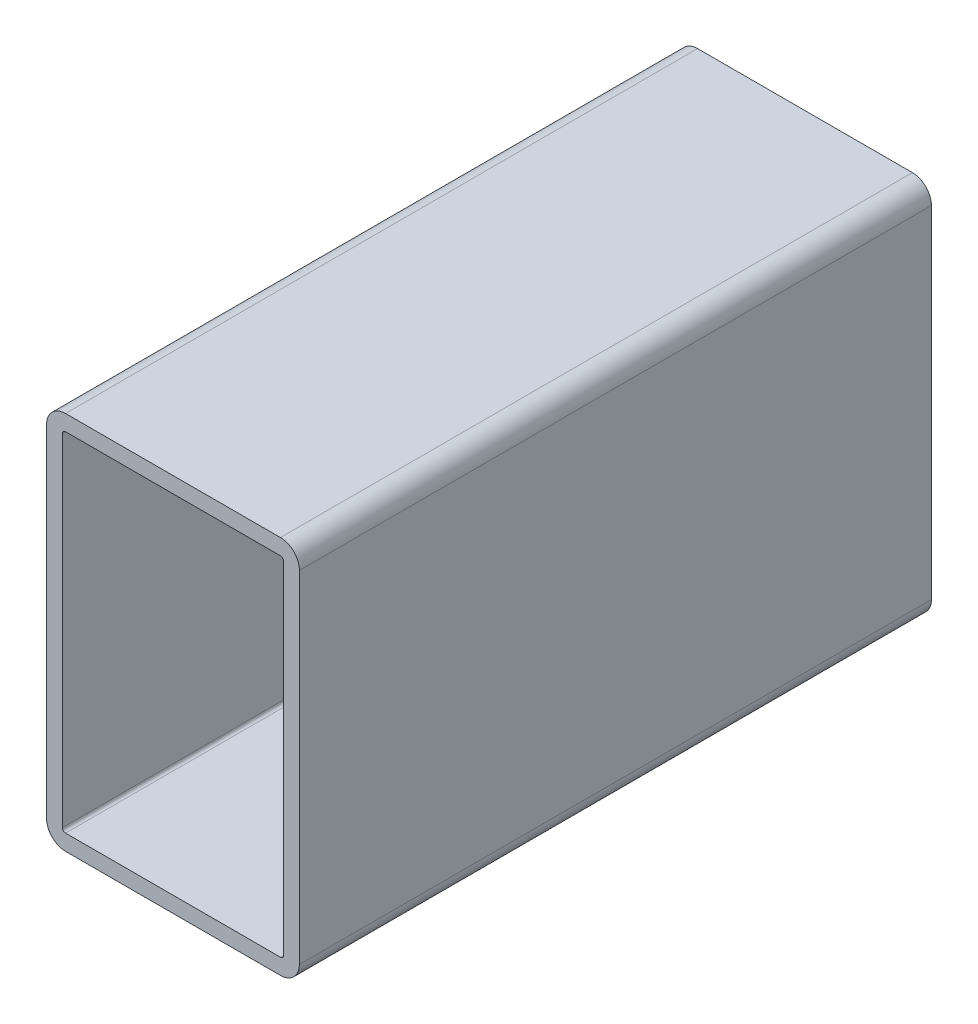
ISO-10303-21;
HEADER;
FILE_DESCRIPTION(('STEP AP214'),'2;1');
FILE_NAME('part.step','',(''),(''),'','','');
FILE_SCHEMA(('AUTOMOTIVE_DESIGN { 1 0 10303 214 1 1 1 1 }'));
ENDSEC;
DATA;
#1=APPLICATION_CONTEXT('core data for automotive mechanical design processes');
#2=APPLICATION_PROTOCOL_DEFINITION('international standard','automotive_design',2000,#1);
#3=PRODUCT_CONTEXT('',#1,'mechanical');
#4=PRODUCT('Part','Part','',(#3));
#5=PRODUCT_RELATED_PRODUCT_CATEGORY('part','',(#4));
#6=PRODUCT_DEFINITION_FORMATION('','',#4);
#7=PRODUCT_DEFINITION_CONTEXT('part definition',#1,'design');
#8=PRODUCT_DEFINITION('design','',#6,#7);
#9=PRODUCT_DEFINITION_SHAPE('','',#8);
#10=(LENGTH_UNIT() NAMED_UNIT(*) SI_UNIT(.MILLI.,.METRE.));
#11=(NAMED_UNIT(*) PLANE_ANGLE_UNIT() SI_UNIT($,.RADIAN.));
#12=(NAMED_UNIT(*) SI_UNIT($,.STERADIAN.) SOLID_ANGLE_UNIT());
#13=UNCERTAINTY_MEASURE_WITH_UNIT(LENGTH_MEASURE(1.E-05),#10,'distance_accuracy_value','');
#14=(GEOMETRIC_REPRESENTATION_CONTEXT(3) GLOBAL_UNCERTAINTY_ASSIGNED_CONTEXT((#13)) GLOBAL_UNIT_ASSIGNED_CONTEXT((#10,
#11,#12)) REPRESENTATION_CONTEXT('',''));
#15=CARTESIAN_POINT('',(0.,0.,0.));
#16=DIRECTION('',(0.,0.,1.));
#17=DIRECTION('',(1.,0.,0.));
#18=AXIS2_PLACEMENT_3D('',#15,#16,#17);
#19=CARTESIAN_POINT('',(37.,3.,100.));
#20=DIRECTION('',(0.,0.,1.));
#21=DIRECTION('',(1.,0.,0.));
#22=AXIS2_PLACEMENT_3D('',#19,#20,#21);
#23=PLANE('',#22);
#24=CARTESIAN_POINT('',(37.,3.,100.));
#25=DIRECTION('',(0.,0.,1.));
#26=DIRECTION('',(1.,0.,0.));
#27=AXIS2_PLACEMENT_3D('',#24,#25,#26);
#28=CIRCLE('',#27,3.);
#29=CARTESIAN_POINT('',(37.,0.,100.));
#30=VERTEX_POINT('',#29);
#31=CARTESIAN_POINT('',(40.,3.00000000000002,100.));
#32=VERTEX_POINT('',#31);
#33=EDGE_CURVE('E215',#30,#32,#28,.T.);
#34=ORIENTED_EDGE('',*,*,#33,.T.);
#35=DIRECTION('',(0.,1.,0.));
#36=VECTOR('',#35,1.);
#37=CARTESIAN_POINT('',(40.,3.00000000000002,100.));
#38=LINE('',#37,#36);
#39=CARTESIAN_POINT('',(40.,57.,100.));
#40=VERTEX_POINT('',#39);
#41=EDGE_CURVE('E218',#32,#40,#38,.T.);
#42=ORIENTED_EDGE('',*,*,#41,.T.);
#43=CARTESIAN_POINT('',(37.,57.,100.));
#44=DIRECTION('',(0.,0.,1.));
#45=DIRECTION('',(-1.,0.,0.));
#46=AXIS2_PLACEMENT_3D('',#43,#44,#45);
#47=CIRCLE('',#46,3.);
#48=CARTESIAN_POINT('',(37.,60.,100.));
#49=VERTEX_POINT('',#48);
#50=EDGE_CURVE('E221',#40,#49,#47,.T.);
#51=ORIENTED_EDGE('',*,*,#50,.T.);
#52=DIRECTION('',(-1.,0.,0.));
#53=VECTOR('',#52,1.);
#54=CARTESIAN_POINT('',(3.00000000000002,60.,100.));
#55=LINE('',#54,#53);
#56=CARTESIAN_POINT('',(3.00000000000002,60.,100.));
#57=VERTEX_POINT('',#56);
#58=EDGE_CURVE('E223',#49,#57,#55,.T.);
#59=ORIENTED_EDGE('',*,*,#58,.T.);
#60=CARTESIAN_POINT('',(3.,57.,100.));
#61=DIRECTION('',(0.,0.,1.));
#62=DIRECTION('',(-1.,0.,0.));
#63=AXIS2_PLACEMENT_3D('',#60,#61,#62);
#64=CIRCLE('',#63,3.);
#65=CARTESIAN_POINT('',(0.,57.,100.));
#66=VERTEX_POINT('',#65);
#67=EDGE_CURVE('E225',#57,#66,#64,.T.);
#68=ORIENTED_EDGE('',*,*,#67,.T.);
#69=DIRECTION('',(0.,-1.,0.));
#70=VECTOR('',#69,1.);
#71=CARTESIAN_POINT('',(0.,3.00000000000002,100.));
#72=LINE('',#71,#70);
#73=CARTESIAN_POINT('',(0.,3.,100.));
#74=VERTEX_POINT('',#73);
#75=EDGE_CURVE('E227',#66,#74,#72,.T.);
#76=ORIENTED_EDGE('',*,*,#75,.T.);
#77=CARTESIAN_POINT('',(3.,3.,100.));
#78=DIRECTION('',(0.,0.,1.));
#79=DIRECTION('',(-1.,0.,0.));
#80=AXIS2_PLACEMENT_3D('',#77,#78,#79);
#81=CIRCLE('',#80,3.);
#82=CARTESIAN_POINT('',(3.00000000000002,0.,100.));
#83=VERTEX_POINT('',#82);
#84=EDGE_CURVE('E229',#74,#83,#81,.T.);
#85=ORIENTED_EDGE('',*,*,#84,.T.);
#86=DIRECTION('',(1.,0.,0.));
#87=VECTOR('',#86,1.);
#88=CARTESIAN_POINT('',(3.00000000000002,0.,100.));
#89=LINE('',#88,#87);
#90=EDGE_CURVE('E231',#83,#30,#89,.T.);
#91=ORIENTED_EDGE('',*,*,#90,.T.);
#92=EDGE_LOOP('',(#34,#42,#51,#59,#68,#76,#85,#91));
#93=FACE_BOUND('',#92,.T.);
#94=DIRECTION('',(1.,0.,0.));
#95=VECTOR('',#94,1.);
#96=CARTESIAN_POINT('',(3.00000000000002,2.5,100.));
#97=LINE('',#96,#95);
#98=CARTESIAN_POINT('',(3.00000000000002,2.5,100.));
#99=VERTEX_POINT('',#98);
#100=CARTESIAN_POINT('',(37.,2.5,100.));
#101=VERTEX_POINT('',#100);
#102=EDGE_CURVE('E158',#99,#101,#97,.T.);
#103=ORIENTED_EDGE('',*,*,#102,.F.);
#104=CARTESIAN_POINT('',(3.,3.,100.));
#105=DIRECTION('',(0.,0.,1.));
#106=DIRECTION('',(-1.,0.,0.));
#107=AXIS2_PLACEMENT_3D('',#104,#105,#106);
#108=CIRCLE('',#107,0.5);
#109=CARTESIAN_POINT('',(2.5,3.00000000000002,100.));
#110=VERTEX_POINT('',#109);
#111=EDGE_CURVE('E150',#110,#99,#108,.T.);
#112=ORIENTED_EDGE('',*,*,#111,.F.);
#113=DIRECTION('',(0.,-1.,0.));
#114=VECTOR('',#113,1.);
#115=CARTESIAN_POINT('',(2.5,3.00000000000002,100.));
#116=LINE('',#115,#114);
#117=CARTESIAN_POINT('',(2.5,57.,100.));
#118=VERTEX_POINT('',#117);
#119=EDGE_CURVE('E183',#118,#110,#116,.T.);
#120=ORIENTED_EDGE('',*,*,#119,.F.);
#121=CARTESIAN_POINT('',(3.,57.,100.));
#122=DIRECTION('',(0.,0.,1.));
#123=DIRECTION('',(-1.,0.,0.));
#124=AXIS2_PLACEMENT_3D('',#121,#122,#123);
#125=CIRCLE('',#124,0.500000000000001);
#126=CARTESIAN_POINT('',(3.00000000000002,57.5,100.));
#127=VERTEX_POINT('',#126);
#128=EDGE_CURVE('E181',#127,#118,#125,.T.);
#129=ORIENTED_EDGE('',*,*,#128,.F.);
#130=DIRECTION('',(-1.,0.,0.));
#131=VECTOR('',#130,1.);
#132=CARTESIAN_POINT('',(3.00000000000002,57.5,100.));
#133=LINE('',#132,#131);
#134=CARTESIAN_POINT('',(37.,57.5,100.));
#135=VERTEX_POINT('',#134);
#136=EDGE_CURVE('E179',#135,#127,#133,.T.);
#137=ORIENTED_EDGE('',*,*,#136,.F.);
#138=CARTESIAN_POINT('',(37.,57.,100.));
#139=DIRECTION('',(0.,0.,1.));
#140=DIRECTION('',(-1.,0.,0.));
#141=AXIS2_PLACEMENT_3D('',#138,#139,#140);
#142=CIRCLE('',#141,0.500000000000007);
#143=CARTESIAN_POINT('',(37.5,57.,100.));
#144=VERTEX_POINT('',#143);
#145=EDGE_CURVE('E177',#144,#135,#142,.T.);
#146=ORIENTED_EDGE('',*,*,#145,.F.);
#147=DIRECTION('',(0.,1.,0.));
#148=VECTOR('',#147,1.);
#149=CARTESIAN_POINT('',(37.5,3.,100.));
#150=LINE('',#149,#148);
#151=CARTESIAN_POINT('',(37.5,3.,100.));
#152=VERTEX_POINT('',#151);
#153=EDGE_CURVE('E173',#152,#144,#150,.T.);
#154=ORIENTED_EDGE('',*,*,#153,.F.);
#155=CARTESIAN_POINT('',(37.,3.,100.));
#156=DIRECTION('',(0.,0.,1.));
#157=DIRECTION('',(1.,0.,0.));
#158=AXIS2_PLACEMENT_3D('',#155,#156,#157);
#159=CIRCLE('',#158,0.5);
#160=EDGE_CURVE('E171',#101,#152,#159,.T.);
#161=ORIENTED_EDGE('',*,*,#160,.F.);
#162=EDGE_LOOP('',(#103,#112,#120,#129,#137,#146,#154,#161));
#163=FACE_BOUND('',#162,.T.);
#164=ADVANCED_FACE('F37',(#93,#163),#23,.T.);
#165=CARTESIAN_POINT('',(37.,3.,0.));
#166=DIRECTION('',(0.,0.,1.));
#167=DIRECTION('',(1.,0.,0.));
#168=AXIS2_PLACEMENT_3D('',#165,#166,#167);
#169=PLANE('',#168);
#170=CARTESIAN_POINT('',(37.,3.,0.));
#171=DIRECTION('',(0.,0.,1.));
#172=DIRECTION('',(1.,0.,0.));
#173=AXIS2_PLACEMENT_3D('',#170,#171,#172);
#174=CIRCLE('',#173,3.);
#175=CARTESIAN_POINT('',(37.,0.,0.));
#176=VERTEX_POINT('',#175);
#177=CARTESIAN_POINT('',(40.,3.00000000000002,0.));
#178=VERTEX_POINT('',#177);
#179=EDGE_CURVE('E166',#176,#178,#174,.T.);
#180=ORIENTED_EDGE('',*,*,#179,.F.);
#181=DIRECTION('',(1.,0.,0.));
#182=VECTOR('',#181,1.);
#183=CARTESIAN_POINT('',(3.00000000000002,0.,0.));
#184=LINE('',#183,#182);
#185=CARTESIAN_POINT('',(3.00000000000002,0.,0.));
#186=VERTEX_POINT('',#185);
#187=EDGE_CURVE('E219',#186,#176,#184,.T.);
#188=ORIENTED_EDGE('',*,*,#187,.F.);
#189=CARTESIAN_POINT('',(3.,3.,0.));
#190=DIRECTION('',(0.,0.,1.));
#191=DIRECTION('',(-1.,0.,0.));
#192=AXIS2_PLACEMENT_3D('',#189,#190,#191);
#193=CIRCLE('',#192,3.);
#194=CARTESIAN_POINT('',(0.,3.,0.));
#195=VERTEX_POINT('',#194);
#196=EDGE_CURVE('E246',#195,#186,#193,.T.);
#197=ORIENTED_EDGE('',*,*,#196,.F.);
#198=DIRECTION('',(0.,-1.,0.));
#199=VECTOR('',#198,1.);
#200=CARTESIAN_POINT('',(0.,3.00000000000002,0.));
#201=LINE('',#200,#199);
#202=CARTESIAN_POINT('',(0.,57.,0.));
#203=VERTEX_POINT('',#202);
#204=EDGE_CURVE('E244',#203,#195,#201,.T.);
#205=ORIENTED_EDGE('',*,*,#204,.F.);
#206=CARTESIAN_POINT('',(3.,57.,0.));
#207=DIRECTION('',(0.,0.,1.));
#208=DIRECTION('',(-1.,0.,0.));
#209=AXIS2_PLACEMENT_3D('',#206,#207,#208);
#210=CIRCLE('',#209,3.);
#211=CARTESIAN_POINT('',(3.00000000000002,60.,0.));
#212=VERTEX_POINT('',#211);
#213=EDGE_CURVE('E242',#212,#203,#210,.T.);
#214=ORIENTED_EDGE('',*,*,#213,.F.);
#215=DIRECTION('',(-1.,0.,0.));
#216=VECTOR('',#215,1.);
#217=CARTESIAN_POINT('',(3.00000000000002,60.,0.));
#218=LINE('',#217,#216);
#219=CARTESIAN_POINT('',(37.,60.,0.));
#220=VERTEX_POINT('',#219);
#221=EDGE_CURVE('E240',#220,#212,#218,.T.);
#222=ORIENTED_EDGE('',*,*,#221,.F.);
#223=CARTESIAN_POINT('',(37.,57.,0.));
#224=DIRECTION('',(0.,0.,1.));
#225=DIRECTION('',(-1.,0.,0.));
#226=AXIS2_PLACEMENT_3D('',#223,#224,#225);
#227=CIRCLE('',#226,3.);
#228=CARTESIAN_POINT('',(40.,57.,0.));
#229=VERTEX_POINT('',#228);
#230=EDGE_CURVE('E238',#229,#220,#227,.T.);
#231=ORIENTED_EDGE('',*,*,#230,.F.);
#232=DIRECTION('',(0.,1.,0.));
#233=VECTOR('',#232,1.);
#234=CARTESIAN_POINT('',(40.,3.00000000000002,0.));
#235=LINE('',#234,#233);
#236=EDGE_CURVE('E236',#178,#229,#235,.T.);
#237=ORIENTED_EDGE('',*,*,#236,.F.);
#238=EDGE_LOOP('',(#180,#188,#197,#205,#214,#222,#231,#237));
#239=FACE_BOUND('',#238,.T.);
#240=CARTESIAN_POINT('',(3.,3.,0.));
#241=DIRECTION('',(0.,0.,1.));
#242=DIRECTION('',(-1.,0.,0.));
#243=AXIS2_PLACEMENT_3D('',#240,#241,#242);
#244=CIRCLE('',#243,0.5);
#245=CARTESIAN_POINT('',(2.5,3.00000000000002,0.));
#246=VERTEX_POINT('',#245);
#247=CARTESIAN_POINT('',(3.00000000000002,2.5,0.));
#248=VERTEX_POINT('',#247);
#249=EDGE_CURVE('E60',#246,#248,#244,.T.);
#250=ORIENTED_EDGE('',*,*,#249,.T.);
#251=DIRECTION('',(1.,0.,0.));
#252=VECTOR('',#251,1.);
#253=CARTESIAN_POINT('',(3.00000000000002,2.5,0.));
#254=LINE('',#253,#252);
#255=CARTESIAN_POINT('',(37.,2.5,0.));
#256=VERTEX_POINT('',#255);
#257=EDGE_CURVE('E165',#248,#256,#254,.T.);
#258=ORIENTED_EDGE('',*,*,#257,.T.);
#259=CARTESIAN_POINT('',(37.,3.,0.));
#260=DIRECTION('',(0.,0.,1.));
#261=DIRECTION('',(1.,0.,0.));
#262=AXIS2_PLACEMENT_3D('',#259,#260,#261);
#263=CIRCLE('',#262,0.5);
#264=CARTESIAN_POINT('',(37.5,3.,0.));
#265=VERTEX_POINT('',#264);
#266=EDGE_CURVE('E187',#256,#265,#263,.T.);
#267=ORIENTED_EDGE('',*,*,#266,.T.);
#268=DIRECTION('',(0.,1.,0.));
#269=VECTOR('',#268,1.);
#270=CARTESIAN_POINT('',(37.5,3.,0.));
#271=LINE('',#270,#269);
#272=CARTESIAN_POINT('',(37.5,57.,0.));
#273=VERTEX_POINT('',#272);
#274=EDGE_CURVE('E190',#265,#273,#271,.T.);
#275=ORIENTED_EDGE('',*,*,#274,.T.);
#276=CARTESIAN_POINT('',(37.,57.,0.));
#277=DIRECTION('',(0.,0.,1.));
#278=DIRECTION('',(-1.,0.,0.));
#279=AXIS2_PLACEMENT_3D('',#276,#277,#278);
#280=CIRCLE('',#279,0.500000000000007);
#281=CARTESIAN_POINT('',(37.,57.5,0.));
#282=VERTEX_POINT('',#281);
#283=EDGE_CURVE('E193',#273,#282,#280,.T.);
#284=ORIENTED_EDGE('',*,*,#283,.T.);
#285=DIRECTION('',(-1.,0.,0.));
#286=VECTOR('',#285,1.);
#287=CARTESIAN_POINT('',(3.00000000000002,57.5,0.));
#288=LINE('',#287,#286);
#289=CARTESIAN_POINT('',(3.00000000000002,57.5,0.));
#290=VERTEX_POINT('',#289);
#291=EDGE_CURVE('E196',#282,#290,#288,.T.);
#292=ORIENTED_EDGE('',*,*,#291,.T.);
#293=CARTESIAN_POINT('',(3.,57.,0.));
#294=DIRECTION('',(0.,0.,1.));
#295=DIRECTION('',(-1.,0.,0.));
#296=AXIS2_PLACEMENT_3D('',#293,#294,#295);
#297=CIRCLE('',#296,0.500000000000001);
#298=CARTESIAN_POINT('',(2.5,57.,0.));
#299=VERTEX_POINT('',#298);
#300=EDGE_CURVE('E199',#290,#299,#297,.T.);
#301=ORIENTED_EDGE('',*,*,#300,.T.);
#302=DIRECTION('',(0.,-1.,0.));
#303=VECTOR('',#302,1.);
#304=CARTESIAN_POINT('',(2.5,3.00000000000002,0.));
#305=LINE('',#304,#303);
#306=EDGE_CURVE('E159',#299,#246,#305,.T.);
#307=ORIENTED_EDGE('',*,*,#306,.T.);
#308=EDGE_LOOP('',(#250,#258,#267,#275,#284,#292,#301,#307));
#309=FACE_BOUND('',#308,.T.);
#310=ADVANCED_FACE('F276',(#239,#309),#169,.F.);
#311=CARTESIAN_POINT('',(37.,3.,100.));
#312=DIRECTION('',(0.,0.,-1.));
#313=DIRECTION('',(-1.,0.,0.));
#314=AXIS2_PLACEMENT_3D('',#311,#312,#313);
#315=CYLINDRICAL_SURFACE('',#314,3.);
#316=ORIENTED_EDGE('',*,*,#179,.T.);
#317=DIRECTION('',(0.,0.,-1.));
#318=VECTOR('',#317,1.);
#319=CARTESIAN_POINT('',(40.,3.00000000000002,100.));
#320=LINE('',#319,#318);
#321=EDGE_CURVE('E11',#32,#178,#320,.T.);
#322=ORIENTED_EDGE('',*,*,#321,.F.);
#323=ORIENTED_EDGE('',*,*,#33,.F.);
#324=DIRECTION('',(0.,0.,-1.));
#325=VECTOR('',#324,1.);
#326=CARTESIAN_POINT('',(37.,0.,100.));
#327=LINE('',#326,#325);
#328=EDGE_CURVE('E233',#30,#176,#327,.T.);
#329=ORIENTED_EDGE('',*,*,#328,.T.);
#330=EDGE_LOOP('',(#316,#322,#323,#329));
#331=FACE_BOUND('',#330,.T.);
#332=ADVANCED_FACE('F39',(#331),#315,.T.);
#333=CARTESIAN_POINT('',(40.,3.00000000000002,100.));
#334=DIRECTION('',(-1.,0.,0.));
#335=DIRECTION('',(0.,-1.,0.));
#336=AXIS2_PLACEMENT_3D('',#333,#334,#335);
#337=PLANE('',#336);
#338=ORIENTED_EDGE('',*,*,#236,.T.);
#339=DIRECTION('',(0.,0.,-1.));
#340=VECTOR('',#339,1.);
#341=CARTESIAN_POINT('',(40.,57.,100.));
#342=LINE('',#341,#340);
#343=EDGE_CURVE('E45',#40,#229,#342,.T.);
#344=ORIENTED_EDGE('',*,*,#343,.F.);
#345=ORIENTED_EDGE('',*,*,#41,.F.);
#346=ORIENTED_EDGE('',*,*,#321,.T.);
#347=EDGE_LOOP('',(#338,#344,#345,#346));
#348=FACE_BOUND('',#347,.T.);
#349=ADVANCED_FACE('F293',(#348),#337,.F.);
#350=CARTESIAN_POINT('',(37.,57.,100.));
#351=DIRECTION('',(0.,0.,-1.));
#352=DIRECTION('',(-1.,0.,0.));
#353=AXIS2_PLACEMENT_3D('',#350,#351,#352);
#354=CYLINDRICAL_SURFACE('',#353,3.);
#355=ORIENTED_EDGE('',*,*,#230,.T.);
#356=DIRECTION('',(0.,0.,-1.));
#357=VECTOR('',#356,1.);
#358=CARTESIAN_POINT('',(37.,60.,100.));
#359=LINE('',#358,#357);
#360=EDGE_CURVE('E263',#49,#220,#359,.T.);
#361=ORIENTED_EDGE('',*,*,#360,.F.);
#362=ORIENTED_EDGE('',*,*,#50,.F.);
#363=ORIENTED_EDGE('',*,*,#343,.T.);
#364=EDGE_LOOP('',(#355,#361,#362,#363));
#365=FACE_BOUND('',#364,.T.);
#366=ADVANCED_FACE('F270',(#365),#354,.T.);
#367=CARTESIAN_POINT('',(3.00000000000002,60.,100.));
#368=DIRECTION('',(0.,-1.,0.));
#369=DIRECTION('',(0.,0.,-1.));
#370=AXIS2_PLACEMENT_3D('',#367,#368,#369);
#371=PLANE('',#370);
#372=ORIENTED_EDGE('',*,*,#221,.T.);
#373=DIRECTION('',(0.,0.,-1.));
#374=VECTOR('',#373,1.);
#375=CARTESIAN_POINT('',(3.00000000000002,60.,100.));
#376=LINE('',#375,#374);
#377=EDGE_CURVE('E260',#57,#212,#376,.T.);
#378=ORIENTED_EDGE('',*,*,#377,.F.);
#379=ORIENTED_EDGE('',*,*,#58,.F.);
#380=ORIENTED_EDGE('',*,*,#360,.T.);
#381=EDGE_LOOP('',(#372,#378,#379,#380));
#382=FACE_BOUND('',#381,.T.);
#383=ADVANCED_FACE('F282',(#382),#371,.F.);
#384=CARTESIAN_POINT('',(3.,57.,100.));
#385=DIRECTION('',(0.,0.,-1.));
#386=DIRECTION('',(-1.,0.,0.));
#387=AXIS2_PLACEMENT_3D('',#384,#385,#386);
#388=CYLINDRICAL_SURFACE('',#387,3.);
#389=ORIENTED_EDGE('',*,*,#213,.T.);
#390=DIRECTION('',(0.,0.,-1.));
#391=VECTOR('',#390,1.);
#392=CARTESIAN_POINT('',(0.,57.,100.));
#393=LINE('',#392,#391);
#394=EDGE_CURVE('E257',#66,#203,#393,.T.);
#395=ORIENTED_EDGE('',*,*,#394,.F.);
#396=ORIENTED_EDGE('',*,*,#67,.F.);
#397=ORIENTED_EDGE('',*,*,#377,.T.);
#398=EDGE_LOOP('',(#389,#395,#396,#397));
#399=FACE_BOUND('',#398,.T.);
#400=ADVANCED_FACE('F286',(#399),#388,.T.);
#401=CARTESIAN_POINT('',(0.,3.00000000000002,100.));
#402=DIRECTION('',(1.,0.,0.));
#403=DIRECTION('',(0.,0.,-1.));
#404=AXIS2_PLACEMENT_3D('',#401,#402,#403);
#405=PLANE('',#404);
#406=ORIENTED_EDGE('',*,*,#204,.T.);
#407=DIRECTION('',(0.,0.,-1.));
#408=VECTOR('',#407,1.);
#409=CARTESIAN_POINT('',(0.,3.,100.));
#410=LINE('',#409,#408);
#411=EDGE_CURVE('E254',#74,#195,#410,.T.);
#412=ORIENTED_EDGE('',*,*,#411,.F.);
#413=ORIENTED_EDGE('',*,*,#75,.F.);
#414=ORIENTED_EDGE('',*,*,#394,.T.);
#415=EDGE_LOOP('',(#406,#412,#413,#414));
#416=FACE_BOUND('',#415,.T.);
#417=ADVANCED_FACE('F306',(#416),#405,.F.);
#418=CARTESIAN_POINT('',(3.,3.,100.));
#419=DIRECTION('',(0.,0.,-1.));
#420=DIRECTION('',(-1.,0.,0.));
#421=AXIS2_PLACEMENT_3D('',#418,#419,#420);
#422=CYLINDRICAL_SURFACE('',#421,3.);
#423=ORIENTED_EDGE('',*,*,#196,.T.);
#424=DIRECTION('',(0.,0.,-1.));
#425=VECTOR('',#424,1.);
#426=CARTESIAN_POINT('',(3.00000000000002,0.,100.));
#427=LINE('',#426,#425);
#428=EDGE_CURVE('E251',#83,#186,#427,.T.);
#429=ORIENTED_EDGE('',*,*,#428,.F.);
#430=ORIENTED_EDGE('',*,*,#84,.F.);
#431=ORIENTED_EDGE('',*,*,#411,.T.);
#432=EDGE_LOOP('',(#423,#429,#430,#431));
#433=FACE_BOUND('',#432,.T.);
#434=ADVANCED_FACE('F304',(#433),#422,.T.);
#435=CARTESIAN_POINT('',(3.00000000000002,0.,100.));
#436=DIRECTION('',(0.,1.,0.));
#437=DIRECTION('',(0.,0.,1.));
#438=AXIS2_PLACEMENT_3D('',#435,#436,#437);
#439=PLANE('',#438);
#440=ORIENTED_EDGE('',*,*,#187,.T.);
#441=ORIENTED_EDGE('',*,*,#328,.F.);
#442=ORIENTED_EDGE('',*,*,#90,.F.);
#443=ORIENTED_EDGE('',*,*,#428,.T.);
#444=EDGE_LOOP('',(#440,#441,#442,#443));
#445=FACE_BOUND('',#444,.T.);
#446=ADVANCED_FACE('F299',(#445),#439,.F.);
#447=CARTESIAN_POINT('',(3.,3.,100.));
#448=DIRECTION('',(0.,0.,-1.));
#449=DIRECTION('',(-1.,0.,0.));
#450=AXIS2_PLACEMENT_3D('',#447,#448,#449);
#451=CYLINDRICAL_SURFACE('',#450,0.5);
#452=ORIENTED_EDGE('',*,*,#249,.F.);
#453=DIRECTION('',(0.,0.,-1.));
#454=VECTOR('',#453,1.);
#455=CARTESIAN_POINT('',(2.5,3.00000000000002,100.));
#456=LINE('',#455,#454);
#457=EDGE_CURVE('E154',#110,#246,#456,.T.);
#458=ORIENTED_EDGE('',*,*,#457,.F.);
#459=ORIENTED_EDGE('',*,*,#111,.T.);
#460=DIRECTION('',(0.,0.,-1.));
#461=VECTOR('',#460,1.);
#462=CARTESIAN_POINT('',(3.00000000000002,2.5,100.));
#463=LINE('',#462,#461);
#464=EDGE_CURVE('E153',#99,#248,#463,.T.);
#465=ORIENTED_EDGE('',*,*,#464,.T.);
#466=EDGE_LOOP('',(#452,#458,#459,#465));
#467=FACE_BOUND('',#466,.T.);
#468=ADVANCED_FACE('F152',(#467),#451,.F.);
#469=CARTESIAN_POINT('',(3.00000000000002,2.5,100.));
#470=DIRECTION('',(0.,1.,0.));
#471=DIRECTION('',(0.,0.,1.));
#472=AXIS2_PLACEMENT_3D('',#469,#470,#471);
#473=PLANE('',#472);
#474=ORIENTED_EDGE('',*,*,#257,.F.);
#475=ORIENTED_EDGE('',*,*,#464,.F.);
#476=ORIENTED_EDGE('',*,*,#102,.T.);
#477=DIRECTION('',(0.,0.,-1.));
#478=VECTOR('',#477,1.);
#479=CARTESIAN_POINT('',(37.,2.5,100.));
#480=LINE('',#479,#478);
#481=EDGE_CURVE('E167',#101,#256,#480,.T.);
#482=ORIENTED_EDGE('',*,*,#481,.T.);
#483=EDGE_LOOP('',(#474,#475,#476,#482));
#484=FACE_BOUND('',#483,.T.);
#485=ADVANCED_FACE('F162',(#484),#473,.T.);
#486=CARTESIAN_POINT('',(37.,3.,100.));
#487=DIRECTION('',(0.,0.,-1.));
#488=DIRECTION('',(-1.,0.,0.));
#489=AXIS2_PLACEMENT_3D('',#486,#487,#488);
#490=CYLINDRICAL_SURFACE('',#489,0.5);
#491=ORIENTED_EDGE('',*,*,#266,.F.);
#492=ORIENTED_EDGE('',*,*,#481,.F.);
#493=ORIENTED_EDGE('',*,*,#160,.T.);
#494=DIRECTION('',(0.,0.,-1.));
#495=VECTOR('',#494,1.);
#496=CARTESIAN_POINT('',(37.5,3.,100.));
#497=LINE('',#496,#495);
#498=EDGE_CURVE('E212',#152,#265,#497,.T.);
#499=ORIENTED_EDGE('',*,*,#498,.T.);
#500=EDGE_LOOP('',(#491,#492,#493,#499));
#501=FACE_BOUND('',#500,.T.);
#502=ADVANCED_FACE('F331',(#501),#490,.F.);
#503=CARTESIAN_POINT('',(37.5,3.,100.));
#504=DIRECTION('',(-1.,0.,0.));
#505=DIRECTION('',(0.,0.,1.));
#506=AXIS2_PLACEMENT_3D('',#503,#504,#505);
#507=PLANE('',#506);
#508=ORIENTED_EDGE('',*,*,#274,.F.);
#509=ORIENTED_EDGE('',*,*,#498,.F.);
#510=ORIENTED_EDGE('',*,*,#153,.T.);
#511=DIRECTION('',(0.,0.,-1.));
#512=VECTOR('',#511,1.);
#513=CARTESIAN_POINT('',(37.5,57.,100.));
#514=LINE('',#513,#512);
#515=EDGE_CURVE('E210',#144,#273,#514,.T.);
#516=ORIENTED_EDGE('',*,*,#515,.T.);
#517=EDGE_LOOP('',(#508,#509,#510,#516));
#518=FACE_BOUND('',#517,.T.);
#519=ADVANCED_FACE('F335',(#518),#507,.T.);
#520=CARTESIAN_POINT('',(37.,57.,100.));
#521=DIRECTION('',(0.,0.,-1.));
#522=DIRECTION('',(-1.,0.,0.));
#523=AXIS2_PLACEMENT_3D('',#520,#521,#522);
#524=CYLINDRICAL_SURFACE('',#523,0.500000000000007);
#525=ORIENTED_EDGE('',*,*,#283,.F.);
#526=ORIENTED_EDGE('',*,*,#515,.F.);
#527=ORIENTED_EDGE('',*,*,#145,.T.);
#528=DIRECTION('',(0.,0.,-1.));
#529=VECTOR('',#528,1.);
#530=CARTESIAN_POINT('',(37.,57.5,100.));
#531=LINE('',#530,#529);
#532=EDGE_CURVE('E208',#135,#282,#531,.T.);
#533=ORIENTED_EDGE('',*,*,#532,.T.);
#534=EDGE_LOOP('',(#525,#526,#527,#533));
#535=FACE_BOUND('',#534,.T.);
#536=ADVANCED_FACE('F341',(#535),#524,.F.);
#537=CARTESIAN_POINT('',(3.00000000000002,57.5,100.));
#538=DIRECTION('',(0.,-1.,0.));
#539=DIRECTION('',(0.,0.,-1.));
#540=AXIS2_PLACEMENT_3D('',#537,#538,#539);
#541=PLANE('',#540);
#542=ORIENTED_EDGE('',*,*,#291,.F.);
#543=ORIENTED_EDGE('',*,*,#532,.F.);
#544=ORIENTED_EDGE('',*,*,#136,.T.);
#545=DIRECTION('',(0.,0.,-1.));
#546=VECTOR('',#545,1.);
#547=CARTESIAN_POINT('',(3.00000000000002,57.5,100.));
#548=LINE('',#547,#546);
#549=EDGE_CURVE('E206',#127,#290,#548,.T.);
#550=ORIENTED_EDGE('',*,*,#549,.T.);
#551=EDGE_LOOP('',(#542,#543,#544,#550));
#552=FACE_BOUND('',#551,.T.);
#553=ADVANCED_FACE('F345',(#552),#541,.T.);
#554=CARTESIAN_POINT('',(3.,57.,100.));
#555=DIRECTION('',(0.,0.,-1.));
#556=DIRECTION('',(-1.,0.,0.));
#557=AXIS2_PLACEMENT_3D('',#554,#555,#556);
#558=CYLINDRICAL_SURFACE('',#557,0.500000000000001);
#559=ORIENTED_EDGE('',*,*,#300,.F.);
#560=ORIENTED_EDGE('',*,*,#549,.F.);
#561=ORIENTED_EDGE('',*,*,#128,.T.);
#562=DIRECTION('',(0.,0.,-1.));
#563=VECTOR('',#562,1.);
#564=CARTESIAN_POINT('',(2.5,57.,100.));
#565=LINE('',#564,#563);
#566=EDGE_CURVE('E52',#118,#299,#565,.T.);
#567=ORIENTED_EDGE('',*,*,#566,.T.);
#568=EDGE_LOOP('',(#559,#560,#561,#567));
#569=FACE_BOUND('',#568,.T.);
#570=ADVANCED_FACE('F349',(#569),#558,.F.);
#571=CARTESIAN_POINT('',(2.5,3.00000000000002,100.));
#572=DIRECTION('',(1.,0.,0.));
#573=DIRECTION('',(0.,1.,0.));
#574=AXIS2_PLACEMENT_3D('',#571,#572,#573);
#575=PLANE('',#574);
#576=ORIENTED_EDGE('',*,*,#306,.F.);
#577=ORIENTED_EDGE('',*,*,#566,.F.);
#578=ORIENTED_EDGE('',*,*,#119,.T.);
#579=ORIENTED_EDGE('',*,*,#457,.T.);
#580=EDGE_LOOP('',(#576,#577,#578,#579));
#581=FACE_BOUND('',#580,.T.);
#582=ADVANCED_FACE('F353',(#581),#575,.T.);
#583=CLOSED_SHELL('',(#164,#310,#332,#349,#366,#383,#400,#417,#434,#446,#468,#485,#502,#519,
#536,#553,#570,#582));
#584=MANIFOLD_SOLID_BREP('B2',#583);
#585=ADVANCED_BREP_SHAPE_REPRESENTATION('',(#18,#584),#14);
#586=SHAPE_DEFINITION_REPRESENTATION(#9,#585);
ENDSEC;
END-ISO-10303-21;
